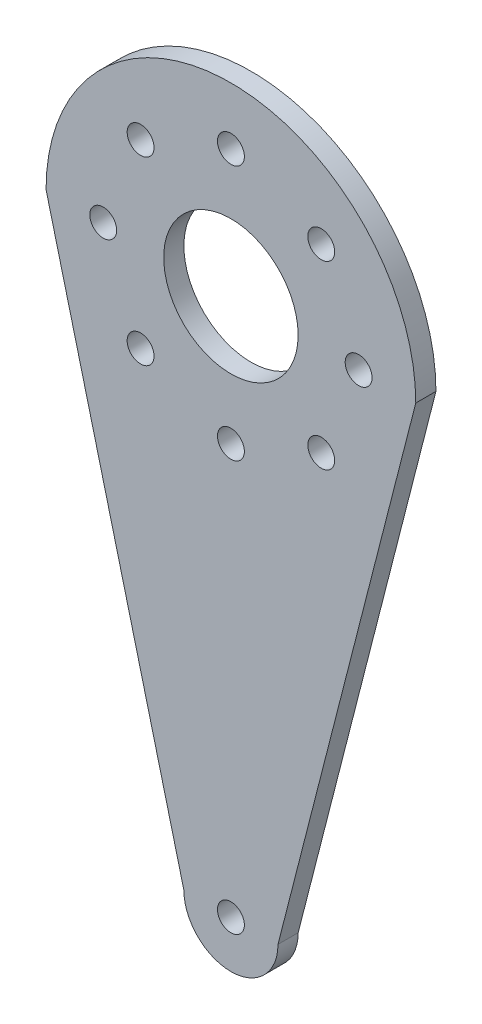
ISO-10303-21;
HEADER;
FILE_DESCRIPTION(('STEP AP214'),'2;1');
FILE_NAME('part.step','',(''),(''),'','','');
FILE_SCHEMA(('AUTOMOTIVE_DESIGN { 1 0 10303 214 1 1 1 1 }'));
ENDSEC;
DATA;
#1=APPLICATION_CONTEXT('core data for automotive mechanical design processes');
#2=APPLICATION_PROTOCOL_DEFINITION('international standard','automotive_design',2000,#1);
#3=PRODUCT_CONTEXT('',#1,'mechanical');
#4=PRODUCT('Part','Part','',(#3));
#5=PRODUCT_RELATED_PRODUCT_CATEGORY('part','',(#4));
#6=PRODUCT_DEFINITION_FORMATION('','',#4);
#7=PRODUCT_DEFINITION_CONTEXT('part definition',#1,'design');
#8=PRODUCT_DEFINITION('design','',#6,#7);
#9=PRODUCT_DEFINITION_SHAPE('','',#8);
#10=(LENGTH_UNIT() NAMED_UNIT(*) SI_UNIT(.MILLI.,.METRE.));
#11=(NAMED_UNIT(*) PLANE_ANGLE_UNIT() SI_UNIT($,.RADIAN.));
#12=(NAMED_UNIT(*) SI_UNIT($,.STERADIAN.) SOLID_ANGLE_UNIT());
#13=UNCERTAINTY_MEASURE_WITH_UNIT(LENGTH_MEASURE(1.E-05),#10,'distance_accuracy_value','');
#14=(GEOMETRIC_REPRESENTATION_CONTEXT(3) GLOBAL_UNCERTAINTY_ASSIGNED_CONTEXT((#13)) GLOBAL_UNIT_ASSIGNED_CONTEXT((#10,
#11,#12)) REPRESENTATION_CONTEXT('',''));
#15=CARTESIAN_POINT('',(0.,0.,0.));
#16=DIRECTION('',(0.,0.,1.));
#17=DIRECTION('',(1.,0.,0.));
#18=AXIS2_PLACEMENT_3D('',#15,#16,#17);
#19=CARTESIAN_POINT('',(249.953360513279,-24.0370683972976,3.));
#20=DIRECTION('',(0.,0.,1.));
#21=DIRECTION('',(1.,0.,0.));
#22=AXIS2_PLACEMENT_3D('',#19,#20,#21);
#23=PLANE('',#22);
#24=CARTESIAN_POINT('',(236.518331670735,42.5279027601581,3.));
#25=DIRECTION('',(0.,0.,1.));
#26=DIRECTION('',(1.,0.,0.));
#27=AXIS2_PLACEMENT_3D('',#24,#25,#26);
#28=CIRCLE('',#27,1.99999999999999);
#29=CARTESIAN_POINT('',(238.518331670735,42.5279027601581,3.));
#30=VERTEX_POINT('',#29);
#31=EDGE_CURVE('E159',#30,#30,#28,.T.);
#32=ORIENTED_EDGE('',*,*,#31,.F.);
#33=EDGE_LOOP('',(#32));
#34=FACE_BOUND('',#33,.T.);
#35=CARTESIAN_POINT('',(263.388389355824,42.5279027601578,3.));
#36=DIRECTION('',(0.,0.,1.));
#37=DIRECTION('',(1.,0.,0.));
#38=AXIS2_PLACEMENT_3D('',#35,#36,#37);
#39=CIRCLE('',#38,2.);
#40=CARTESIAN_POINT('',(265.388389355824,42.5279027601578,3.));
#41=VERTEX_POINT('',#40);
#42=EDGE_CURVE('E147',#41,#41,#39,.T.);
#43=ORIENTED_EDGE('',*,*,#42,.F.);
#44=EDGE_LOOP('',(#43));
#45=FACE_BOUND('',#44,.T.);
#46=CARTESIAN_POINT('',(263.388389355824,69.3979604452467,3.));
#47=DIRECTION('',(0.,0.,1.));
#48=DIRECTION('',(1.,0.,0.));
#49=AXIS2_PLACEMENT_3D('',#46,#47,#48);
#50=CIRCLE('',#49,1.99999999999998);
#51=CARTESIAN_POINT('',(265.388389355824,69.3979604452467,3.));
#52=VERTEX_POINT('',#51);
#53=EDGE_CURVE('E135',#52,#52,#50,.T.);
#54=ORIENTED_EDGE('',*,*,#53,.F.);
#55=EDGE_LOOP('',(#54));
#56=FACE_BOUND('',#55,.T.);
#57=CARTESIAN_POINT('',(236.518331670735,69.3979604452468,3.));
#58=DIRECTION('',(0.,0.,1.));
#59=DIRECTION('',(1.,0.,0.));
#60=AXIS2_PLACEMENT_3D('',#57,#58,#59);
#61=CIRCLE('',#60,1.99999999999999);
#62=CARTESIAN_POINT('',(238.518331670735,69.3979604452468,3.));
#63=VERTEX_POINT('',#62);
#64=EDGE_CURVE('E123',#63,#63,#61,.T.);
#65=ORIENTED_EDGE('',*,*,#64,.F.);
#66=EDGE_LOOP('',(#65));
#67=FACE_BOUND('',#66,.T.);
#68=CARTESIAN_POINT('',(230.953360513279,55.9629316027023,3.));
#69=DIRECTION('',(0.,0.,1.));
#70=DIRECTION('',(1.,0.,0.));
#71=AXIS2_PLACEMENT_3D('',#68,#69,#70);
#72=CIRCLE('',#71,2.);
#73=CARTESIAN_POINT('',(232.953360513279,55.9629316027023,3.));
#74=VERTEX_POINT('',#73);
#75=EDGE_CURVE('E102',#74,#74,#72,.T.);
#76=ORIENTED_EDGE('',*,*,#75,.F.);
#77=EDGE_LOOP('',(#76));
#78=FACE_BOUND('',#77,.T.);
#79=CARTESIAN_POINT('',(249.953360513279,-24.0370683972976,3.));
#80=DIRECTION('',(0.,0.,1.));
#81=DIRECTION('',(1.,0.,0.));
#82=AXIS2_PLACEMENT_3D('',#79,#80,#81);
#83=CIRCLE('',#82,6.99999999999996);
#84=CARTESIAN_POINT('',(242.953360513279,-24.0370683972977,3.));
#85=VERTEX_POINT('',#84);
#86=CARTESIAN_POINT('',(256.953360513279,-24.0370683972977,3.));
#87=VERTEX_POINT('',#86);
#88=EDGE_CURVE('E87',#85,#87,#83,.T.);
#89=ORIENTED_EDGE('',*,*,#88,.T.);
#90=DIRECTION('',(0.248229683721851,0.968701204768194,0.));
#91=VECTOR('',#90,1.);
#92=CARTESIAN_POINT('',(277.453360513279,55.9629316027023,3.));
#93=LINE('',#92,#91);
#94=CARTESIAN_POINT('',(277.453360513279,55.9629316027023,3.));
#95=VERTEX_POINT('',#94);
#96=EDGE_CURVE('E82',#87,#95,#93,.T.);
#97=ORIENTED_EDGE('',*,*,#96,.T.);
#98=CARTESIAN_POINT('',(249.953360513279,55.9629316027023,3.));
#99=DIRECTION('',(0.,0.,1.));
#100=DIRECTION('',(-1.,0.,0.));
#101=AXIS2_PLACEMENT_3D('',#98,#99,#100);
#102=CIRCLE('',#101,27.5000000000001);
#103=CARTESIAN_POINT('',(222.453360513279,55.9629316027023,3.));
#104=VERTEX_POINT('',#103);
#105=EDGE_CURVE('E85',#95,#104,#102,.T.);
#106=ORIENTED_EDGE('',*,*,#105,.T.);
#107=DIRECTION('',(0.248229683721851,-0.968701204768194,0.));
#108=VECTOR('',#107,1.);
#109=CARTESIAN_POINT('',(242.953360513279,-24.0370683972977,3.));
#110=LINE('',#109,#108);
#111=EDGE_CURVE('E52',#104,#85,#110,.T.);
#112=ORIENTED_EDGE('',*,*,#111,.T.);
#113=EDGE_LOOP('',(#89,#97,#106,#112));
#114=FACE_BOUND('',#113,.T.);
#115=CARTESIAN_POINT('',(249.953360513279,-24.0370683972977,3.));
#116=DIRECTION('',(0.,0.,1.));
#117=DIRECTION('',(1.,0.,0.));
#118=AXIS2_PLACEMENT_3D('',#115,#116,#117);
#119=CIRCLE('',#118,1.99999999999997);
#120=CARTESIAN_POINT('',(251.953360513279,-24.0370683972977,3.));
#121=VERTEX_POINT('',#120);
#122=EDGE_CURVE('E117',#121,#121,#119,.T.);
#123=ORIENTED_EDGE('',*,*,#122,.F.);
#124=EDGE_LOOP('',(#123));
#125=FACE_BOUND('',#124,.T.);
#126=CARTESIAN_POINT('',(249.953360513279,74.9629316027023,3.));
#127=DIRECTION('',(0.,0.,1.));
#128=DIRECTION('',(1.,0.,0.));
#129=AXIS2_PLACEMENT_3D('',#126,#127,#128);
#130=CIRCLE('',#129,2.);
#131=CARTESIAN_POINT('',(251.953360513279,74.9629316027023,3.));
#132=VERTEX_POINT('',#131);
#133=EDGE_CURVE('E129',#132,#132,#130,.T.);
#134=ORIENTED_EDGE('',*,*,#133,.F.);
#135=EDGE_LOOP('',(#134));
#136=FACE_BOUND('',#135,.T.);
#137=CARTESIAN_POINT('',(268.953360513279,55.9629316027022,3.));
#138=DIRECTION('',(0.,0.,1.));
#139=DIRECTION('',(1.,0.,0.));
#140=AXIS2_PLACEMENT_3D('',#137,#138,#139);
#141=CIRCLE('',#140,1.99999999999999);
#142=CARTESIAN_POINT('',(270.953360513279,55.9629316027022,3.));
#143=VERTEX_POINT('',#142);
#144=EDGE_CURVE('E141',#143,#143,#141,.T.);
#145=ORIENTED_EDGE('',*,*,#144,.F.);
#146=EDGE_LOOP('',(#145));
#147=FACE_BOUND('',#146,.T.);
#148=CARTESIAN_POINT('',(249.953360513279,36.9629316027023,3.));
#149=DIRECTION('',(0.,0.,1.));
#150=DIRECTION('',(1.,0.,0.));
#151=AXIS2_PLACEMENT_3D('',#148,#149,#150);
#152=CIRCLE('',#151,1.99999999999999);
#153=CARTESIAN_POINT('',(251.953360513279,36.9629316027023,3.));
#154=VERTEX_POINT('',#153);
#155=EDGE_CURVE('E153',#154,#154,#152,.T.);
#156=ORIENTED_EDGE('',*,*,#155,.F.);
#157=EDGE_LOOP('',(#156));
#158=FACE_BOUND('',#157,.T.);
#159=CARTESIAN_POINT('',(249.953360513279,55.9629316027023,3.));
#160=DIRECTION('',(0.,0.,1.));
#161=DIRECTION('',(1.,0.,0.));
#162=AXIS2_PLACEMENT_3D('',#159,#160,#161);
#163=CIRCLE('',#162,10.);
#164=CARTESIAN_POINT('',(259.953360513279,55.9629316027023,3.));
#165=VERTEX_POINT('',#164);
#166=EDGE_CURVE('E165',#165,#165,#163,.T.);
#167=ORIENTED_EDGE('',*,*,#166,.F.);
#168=EDGE_LOOP('',(#167));
#169=FACE_BOUND('',#168,.T.);
#170=ADVANCED_FACE('F35',(#34,#45,#56,#67,#78,#114,#125,#136,#147,#158,#169),#23,.T.);
#171=CARTESIAN_POINT('',(249.953360513279,-24.0370683972976,0.));
#172=DIRECTION('',(0.,0.,1.));
#173=DIRECTION('',(1.,0.,0.));
#174=AXIS2_PLACEMENT_3D('',#171,#172,#173);
#175=PLANE('',#174);
#176=CARTESIAN_POINT('',(249.953360513279,-24.0370683972976,0.));
#177=DIRECTION('',(0.,0.,1.));
#178=DIRECTION('',(1.,0.,0.));
#179=AXIS2_PLACEMENT_3D('',#176,#177,#178);
#180=CIRCLE('',#179,6.99999999999996);
#181=CARTESIAN_POINT('',(242.953360513279,-24.0370683972977,0.));
#182=VERTEX_POINT('',#181);
#183=CARTESIAN_POINT('',(256.953360513279,-24.0370683972977,0.));
#184=VERTEX_POINT('',#183);
#185=EDGE_CURVE('E99',#182,#184,#180,.T.);
#186=ORIENTED_EDGE('',*,*,#185,.F.);
#187=DIRECTION('',(0.248229683721851,-0.968701204768194,0.));
#188=VECTOR('',#187,1.);
#189=CARTESIAN_POINT('',(242.953360513279,-24.0370683972977,0.));
#190=LINE('',#189,#188);
#191=CARTESIAN_POINT('',(222.453360513279,55.9629316027023,0.));
#192=VERTEX_POINT('',#191);
#193=EDGE_CURVE('E75',#192,#182,#190,.T.);
#194=ORIENTED_EDGE('',*,*,#193,.F.);
#195=CARTESIAN_POINT('',(249.953360513279,55.9629316027023,0.));
#196=DIRECTION('',(0.,0.,1.));
#197=DIRECTION('',(-1.,0.,0.));
#198=AXIS2_PLACEMENT_3D('',#195,#196,#197);
#199=CIRCLE('',#198,27.5000000000001);
#200=CARTESIAN_POINT('',(277.453360513279,55.9629316027023,0.));
#201=VERTEX_POINT('',#200);
#202=EDGE_CURVE('E69',#201,#192,#199,.T.);
#203=ORIENTED_EDGE('',*,*,#202,.F.);
#204=DIRECTION('',(0.248229683721851,0.968701204768194,0.));
#205=VECTOR('',#204,1.);
#206=CARTESIAN_POINT('',(277.453360513279,55.9629316027023,0.));
#207=LINE('',#206,#205);
#208=EDGE_CURVE('E91',#184,#201,#207,.T.);
#209=ORIENTED_EDGE('',*,*,#208,.F.);
#210=EDGE_LOOP('',(#186,#194,#203,#209));
#211=FACE_BOUND('',#210,.T.);
#212=CARTESIAN_POINT('',(230.953360513279,55.9629316027023,0.));
#213=DIRECTION('',(0.,0.,1.));
#214=DIRECTION('',(1.,0.,0.));
#215=AXIS2_PLACEMENT_3D('',#212,#213,#214);
#216=CIRCLE('',#215,2.);
#217=CARTESIAN_POINT('',(232.953360513279,55.9629316027023,0.));
#218=VERTEX_POINT('',#217);
#219=EDGE_CURVE('E114',#218,#218,#216,.T.);
#220=ORIENTED_EDGE('',*,*,#219,.T.);
#221=EDGE_LOOP('',(#220));
#222=FACE_BOUND('',#221,.T.);
#223=CARTESIAN_POINT('',(249.953360513279,-24.0370683972977,0.));
#224=DIRECTION('',(0.,0.,1.));
#225=DIRECTION('',(1.,0.,0.));
#226=AXIS2_PLACEMENT_3D('',#223,#224,#225);
#227=CIRCLE('',#226,1.99999999999997);
#228=CARTESIAN_POINT('',(251.953360513279,-24.0370683972977,0.));
#229=VERTEX_POINT('',#228);
#230=EDGE_CURVE('E120',#229,#229,#227,.T.);
#231=ORIENTED_EDGE('',*,*,#230,.T.);
#232=EDGE_LOOP('',(#231));
#233=FACE_BOUND('',#232,.T.);
#234=CARTESIAN_POINT('',(236.518331670735,69.3979604452468,0.));
#235=DIRECTION('',(0.,0.,1.));
#236=DIRECTION('',(1.,0.,0.));
#237=AXIS2_PLACEMENT_3D('',#234,#235,#236);
#238=CIRCLE('',#237,1.99999999999999);
#239=CARTESIAN_POINT('',(238.518331670735,69.3979604452468,0.));
#240=VERTEX_POINT('',#239);
#241=EDGE_CURVE('E126',#240,#240,#238,.T.);
#242=ORIENTED_EDGE('',*,*,#241,.T.);
#243=EDGE_LOOP('',(#242));
#244=FACE_BOUND('',#243,.T.);
#245=CARTESIAN_POINT('',(249.953360513279,74.9629316027023,0.));
#246=DIRECTION('',(0.,0.,1.));
#247=DIRECTION('',(1.,0.,0.));
#248=AXIS2_PLACEMENT_3D('',#245,#246,#247);
#249=CIRCLE('',#248,2.);
#250=CARTESIAN_POINT('',(251.953360513279,74.9629316027023,0.));
#251=VERTEX_POINT('',#250);
#252=EDGE_CURVE('E132',#251,#251,#249,.T.);
#253=ORIENTED_EDGE('',*,*,#252,.T.);
#254=EDGE_LOOP('',(#253));
#255=FACE_BOUND('',#254,.T.);
#256=CARTESIAN_POINT('',(263.388389355824,69.3979604452467,0.));
#257=DIRECTION('',(0.,0.,1.));
#258=DIRECTION('',(1.,0.,0.));
#259=AXIS2_PLACEMENT_3D('',#256,#257,#258);
#260=CIRCLE('',#259,1.99999999999998);
#261=CARTESIAN_POINT('',(265.388389355824,69.3979604452467,0.));
#262=VERTEX_POINT('',#261);
#263=EDGE_CURVE('E138',#262,#262,#260,.T.);
#264=ORIENTED_EDGE('',*,*,#263,.T.);
#265=EDGE_LOOP('',(#264));
#266=FACE_BOUND('',#265,.T.);
#267=CARTESIAN_POINT('',(268.953360513279,55.9629316027022,0.));
#268=DIRECTION('',(0.,0.,1.));
#269=DIRECTION('',(1.,0.,0.));
#270=AXIS2_PLACEMENT_3D('',#267,#268,#269);
#271=CIRCLE('',#270,1.99999999999999);
#272=CARTESIAN_POINT('',(270.953360513279,55.9629316027022,0.));
#273=VERTEX_POINT('',#272);
#274=EDGE_CURVE('E144',#273,#273,#271,.T.);
#275=ORIENTED_EDGE('',*,*,#274,.T.);
#276=EDGE_LOOP('',(#275));
#277=FACE_BOUND('',#276,.T.);
#278=CARTESIAN_POINT('',(263.388389355824,42.5279027601578,0.));
#279=DIRECTION('',(0.,0.,1.));
#280=DIRECTION('',(1.,0.,0.));
#281=AXIS2_PLACEMENT_3D('',#278,#279,#280);
#282=CIRCLE('',#281,2.);
#283=CARTESIAN_POINT('',(265.388389355824,42.5279027601578,0.));
#284=VERTEX_POINT('',#283);
#285=EDGE_CURVE('E150',#284,#284,#282,.T.);
#286=ORIENTED_EDGE('',*,*,#285,.T.);
#287=EDGE_LOOP('',(#286));
#288=FACE_BOUND('',#287,.T.);
#289=CARTESIAN_POINT('',(249.953360513279,36.9629316027023,0.));
#290=DIRECTION('',(0.,0.,1.));
#291=DIRECTION('',(1.,0.,0.));
#292=AXIS2_PLACEMENT_3D('',#289,#290,#291);
#293=CIRCLE('',#292,1.99999999999999);
#294=CARTESIAN_POINT('',(251.953360513279,36.9629316027023,0.));
#295=VERTEX_POINT('',#294);
#296=EDGE_CURVE('E156',#295,#295,#293,.T.);
#297=ORIENTED_EDGE('',*,*,#296,.T.);
#298=EDGE_LOOP('',(#297));
#299=FACE_BOUND('',#298,.T.);
#300=CARTESIAN_POINT('',(236.518331670735,42.5279027601581,0.));
#301=DIRECTION('',(0.,0.,1.));
#302=DIRECTION('',(1.,0.,0.));
#303=AXIS2_PLACEMENT_3D('',#300,#301,#302);
#304=CIRCLE('',#303,1.99999999999999);
#305=CARTESIAN_POINT('',(238.518331670735,42.5279027601581,0.));
#306=VERTEX_POINT('',#305);
#307=EDGE_CURVE('E162',#306,#306,#304,.T.);
#308=ORIENTED_EDGE('',*,*,#307,.T.);
#309=EDGE_LOOP('',(#308));
#310=FACE_BOUND('',#309,.T.);
#311=CARTESIAN_POINT('',(249.953360513279,55.9629316027023,0.));
#312=DIRECTION('',(0.,0.,1.));
#313=DIRECTION('',(1.,0.,0.));
#314=AXIS2_PLACEMENT_3D('',#311,#312,#313);
#315=CIRCLE('',#314,10.);
#316=CARTESIAN_POINT('',(259.953360513279,55.9629316027023,0.));
#317=VERTEX_POINT('',#316);
#318=EDGE_CURVE('E168',#317,#317,#315,.T.);
#319=ORIENTED_EDGE('',*,*,#318,.T.);
#320=EDGE_LOOP('',(#319));
#321=FACE_BOUND('',#320,.T.);
#322=ADVANCED_FACE('F110',(#211,#222,#233,#244,#255,#266,#277,#288,#299,#310,#321),#175,.F.);
#323=CARTESIAN_POINT('',(249.953360513279,-24.0370683972976,3.));
#324=DIRECTION('',(0.,0.,-1.));
#325=DIRECTION('',(-1.,0.,0.));
#326=AXIS2_PLACEMENT_3D('',#323,#324,#325);
#327=CYLINDRICAL_SURFACE('',#326,6.99999999999996);
#328=ORIENTED_EDGE('',*,*,#185,.T.);
#329=DIRECTION('',(0.,0.,-1.));
#330=VECTOR('',#329,1.);
#331=CARTESIAN_POINT('',(256.953360513279,-24.0370683972977,3.));
#332=LINE('',#331,#330);
#333=EDGE_CURVE('E11',#87,#184,#332,.T.);
#334=ORIENTED_EDGE('',*,*,#333,.F.);
#335=ORIENTED_EDGE('',*,*,#88,.F.);
#336=DIRECTION('',(0.,0.,-1.));
#337=VECTOR('',#336,1.);
#338=CARTESIAN_POINT('',(242.953360513279,-24.0370683972977,3.));
#339=LINE('',#338,#337);
#340=EDGE_CURVE('E95',#85,#182,#339,.T.);
#341=ORIENTED_EDGE('',*,*,#340,.T.);
#342=EDGE_LOOP('',(#328,#334,#335,#341));
#343=FACE_BOUND('',#342,.T.);
#344=ADVANCED_FACE('F37',(#343),#327,.T.);
#345=CARTESIAN_POINT('',(277.453360513279,55.9629316027023,3.));
#346=DIRECTION('',(-0.968701204768194,0.24822968372185,0.));
#347=DIRECTION('',(-0.248229683721851,-0.968701204768194,0.));
#348=AXIS2_PLACEMENT_3D('',#345,#346,#347);
#349=PLANE('',#348);
#350=ORIENTED_EDGE('',*,*,#208,.T.);
#351=DIRECTION('',(0.,0.,-1.));
#352=VECTOR('',#351,1.);
#353=CARTESIAN_POINT('',(277.453360513279,55.9629316027023,3.));
#354=LINE('',#353,#352);
#355=EDGE_CURVE('E44',#95,#201,#354,.T.);
#356=ORIENTED_EDGE('',*,*,#355,.F.);
#357=ORIENTED_EDGE('',*,*,#96,.F.);
#358=ORIENTED_EDGE('',*,*,#333,.T.);
#359=EDGE_LOOP('',(#350,#356,#357,#358));
#360=FACE_BOUND('',#359,.T.);
#361=ADVANCED_FACE('F90',(#360),#349,.F.);
#362=CARTESIAN_POINT('',(249.953360513279,55.9629316027023,3.));
#363=DIRECTION('',(0.,0.,-1.));
#364=DIRECTION('',(-1.,0.,0.));
#365=AXIS2_PLACEMENT_3D('',#362,#363,#364);
#366=CYLINDRICAL_SURFACE('',#365,27.5000000000001);
#367=ORIENTED_EDGE('',*,*,#202,.T.);
#368=DIRECTION('',(0.,0.,-1.));
#369=VECTOR('',#368,1.);
#370=CARTESIAN_POINT('',(222.453360513279,55.9629316027023,3.));
#371=LINE('',#370,#369);
#372=EDGE_CURVE('E92',#104,#192,#371,.T.);
#373=ORIENTED_EDGE('',*,*,#372,.F.);
#374=ORIENTED_EDGE('',*,*,#105,.F.);
#375=ORIENTED_EDGE('',*,*,#355,.T.);
#376=EDGE_LOOP('',(#367,#373,#374,#375));
#377=FACE_BOUND('',#376,.T.);
#378=ADVANCED_FACE('F93',(#377),#366,.T.);
#379=CARTESIAN_POINT('',(242.953360513279,-24.0370683972977,3.));
#380=DIRECTION('',(0.968701204768194,0.248229683721851,0.));
#381=DIRECTION('',(-0.248229683721851,0.968701204768194,0.));
#382=AXIS2_PLACEMENT_3D('',#379,#380,#381);
#383=PLANE('',#382);
#384=ORIENTED_EDGE('',*,*,#193,.T.);
#385=ORIENTED_EDGE('',*,*,#340,.F.);
#386=ORIENTED_EDGE('',*,*,#111,.F.);
#387=ORIENTED_EDGE('',*,*,#372,.T.);
#388=EDGE_LOOP('',(#384,#385,#386,#387));
#389=FACE_BOUND('',#388,.T.);
#390=ADVANCED_FACE('F107',(#389),#383,.F.);
#391=CARTESIAN_POINT('',(230.953360513279,55.9629316027023,3.));
#392=DIRECTION('',(0.,0.,-1.));
#393=DIRECTION('',(-1.,0.,0.));
#394=AXIS2_PLACEMENT_3D('',#391,#392,#393);
#395=CYLINDRICAL_SURFACE('',#394,2.);
#396=ORIENTED_EDGE('',*,*,#75,.T.);
#397=EDGE_LOOP('',(#396));
#398=FACE_BOUND('',#397,.T.);
#399=ORIENTED_EDGE('',*,*,#219,.F.);
#400=EDGE_LOOP('',(#399));
#401=FACE_BOUND('',#400,.T.);
#402=ADVANCED_FACE('F187',(#398,#401),#395,.F.);
#403=CARTESIAN_POINT('',(249.953360513279,-24.0370683972977,3.));
#404=DIRECTION('',(0.,0.,-1.));
#405=DIRECTION('',(-1.,0.,0.));
#406=AXIS2_PLACEMENT_3D('',#403,#404,#405);
#407=CYLINDRICAL_SURFACE('',#406,1.99999999999997);
#408=ORIENTED_EDGE('',*,*,#122,.T.);
#409=EDGE_LOOP('',(#408));
#410=FACE_BOUND('',#409,.T.);
#411=ORIENTED_EDGE('',*,*,#230,.F.);
#412=EDGE_LOOP('',(#411));
#413=FACE_BOUND('',#412,.T.);
#414=ADVANCED_FACE('F233',(#410,#413),#407,.F.);
#415=CARTESIAN_POINT('',(236.518331670735,69.3979604452468,3.));
#416=DIRECTION('',(0.,0.,-1.));
#417=DIRECTION('',(-1.,0.,0.));
#418=AXIS2_PLACEMENT_3D('',#415,#416,#417);
#419=CYLINDRICAL_SURFACE('',#418,1.99999999999999);
#420=ORIENTED_EDGE('',*,*,#64,.T.);
#421=EDGE_LOOP('',(#420));
#422=FACE_BOUND('',#421,.T.);
#423=ORIENTED_EDGE('',*,*,#241,.F.);
#424=EDGE_LOOP('',(#423));
#425=FACE_BOUND('',#424,.T.);
#426=ADVANCED_FACE('F241',(#422,#425),#419,.F.);
#427=CARTESIAN_POINT('',(249.953360513279,74.9629316027023,3.));
#428=DIRECTION('',(0.,0.,-1.));
#429=DIRECTION('',(-1.,0.,0.));
#430=AXIS2_PLACEMENT_3D('',#427,#428,#429);
#431=CYLINDRICAL_SURFACE('',#430,2.);
#432=ORIENTED_EDGE('',*,*,#133,.T.);
#433=EDGE_LOOP('',(#432));
#434=FACE_BOUND('',#433,.T.);
#435=ORIENTED_EDGE('',*,*,#252,.F.);
#436=EDGE_LOOP('',(#435));
#437=FACE_BOUND('',#436,.T.);
#438=ADVANCED_FACE('F249',(#434,#437),#431,.F.);
#439=CARTESIAN_POINT('',(263.388389355824,69.3979604452467,3.));
#440=DIRECTION('',(0.,0.,-1.));
#441=DIRECTION('',(-1.,0.,0.));
#442=AXIS2_PLACEMENT_3D('',#439,#440,#441);
#443=CYLINDRICAL_SURFACE('',#442,1.99999999999998);
#444=ORIENTED_EDGE('',*,*,#53,.T.);
#445=EDGE_LOOP('',(#444));
#446=FACE_BOUND('',#445,.T.);
#447=ORIENTED_EDGE('',*,*,#263,.F.);
#448=EDGE_LOOP('',(#447));
#449=FACE_BOUND('',#448,.T.);
#450=ADVANCED_FACE('F258',(#446,#449),#443,.F.);
#451=CARTESIAN_POINT('',(268.953360513279,55.9629316027022,3.));
#452=DIRECTION('',(0.,0.,-1.));
#453=DIRECTION('',(-1.,0.,0.));
#454=AXIS2_PLACEMENT_3D('',#451,#452,#453);
#455=CYLINDRICAL_SURFACE('',#454,1.99999999999999);
#456=ORIENTED_EDGE('',*,*,#144,.T.);
#457=EDGE_LOOP('',(#456));
#458=FACE_BOUND('',#457,.T.);
#459=ORIENTED_EDGE('',*,*,#274,.F.);
#460=EDGE_LOOP('',(#459));
#461=FACE_BOUND('',#460,.T.);
#462=ADVANCED_FACE('F267',(#458,#461),#455,.F.);
#463=CARTESIAN_POINT('',(263.388389355824,42.5279027601578,3.));
#464=DIRECTION('',(0.,0.,-1.));
#465=DIRECTION('',(-1.,0.,0.));
#466=AXIS2_PLACEMENT_3D('',#463,#464,#465);
#467=CYLINDRICAL_SURFACE('',#466,2.);
#468=ORIENTED_EDGE('',*,*,#42,.T.);
#469=EDGE_LOOP('',(#468));
#470=FACE_BOUND('',#469,.T.);
#471=ORIENTED_EDGE('',*,*,#285,.F.);
#472=EDGE_LOOP('',(#471));
#473=FACE_BOUND('',#472,.T.);
#474=ADVANCED_FACE('F276',(#470,#473),#467,.F.);
#475=CARTESIAN_POINT('',(249.953360513279,36.9629316027023,3.));
#476=DIRECTION('',(0.,0.,-1.));
#477=DIRECTION('',(-1.,0.,0.));
#478=AXIS2_PLACEMENT_3D('',#475,#476,#477);
#479=CYLINDRICAL_SURFACE('',#478,1.99999999999999);
#480=ORIENTED_EDGE('',*,*,#155,.T.);
#481=EDGE_LOOP('',(#480));
#482=FACE_BOUND('',#481,.T.);
#483=ORIENTED_EDGE('',*,*,#296,.F.);
#484=EDGE_LOOP('',(#483));
#485=FACE_BOUND('',#484,.T.);
#486=ADVANCED_FACE('F285',(#482,#485),#479,.F.);
#487=CARTESIAN_POINT('',(236.518331670735,42.5279027601581,3.));
#488=DIRECTION('',(0.,0.,-1.));
#489=DIRECTION('',(-1.,0.,0.));
#490=AXIS2_PLACEMENT_3D('',#487,#488,#489);
#491=CYLINDRICAL_SURFACE('',#490,1.99999999999999);
#492=ORIENTED_EDGE('',*,*,#31,.T.);
#493=EDGE_LOOP('',(#492));
#494=FACE_BOUND('',#493,.T.);
#495=ORIENTED_EDGE('',*,*,#307,.F.);
#496=EDGE_LOOP('',(#495));
#497=FACE_BOUND('',#496,.T.);
#498=ADVANCED_FACE('F294',(#494,#497),#491,.F.);
#499=CARTESIAN_POINT('',(249.953360513279,55.9629316027023,3.));
#500=DIRECTION('',(0.,0.,-1.));
#501=DIRECTION('',(-1.,0.,0.));
#502=AXIS2_PLACEMENT_3D('',#499,#500,#501);
#503=CYLINDRICAL_SURFACE('',#502,10.);
#504=ORIENTED_EDGE('',*,*,#166,.T.);
#505=EDGE_LOOP('',(#504));
#506=FACE_BOUND('',#505,.T.);
#507=ORIENTED_EDGE('',*,*,#318,.F.);
#508=EDGE_LOOP('',(#507));
#509=FACE_BOUND('',#508,.T.);
#510=ADVANCED_FACE('F174',(#506,#509),#503,.F.);
#511=CLOSED_SHELL('',(#170,#322,#344,#361,#378,#390,#402,#414,#426,#438,#450,#462,#474,#486,
#498,#510));
#512=MANIFOLD_SOLID_BREP('B2',#511);
#513=ADVANCED_BREP_SHAPE_REPRESENTATION('',(#18,#512),#14);
#514=SHAPE_DEFINITION_REPRESENTATION(#9,#513);
ENDSEC;
END-ISO-10303-21;
